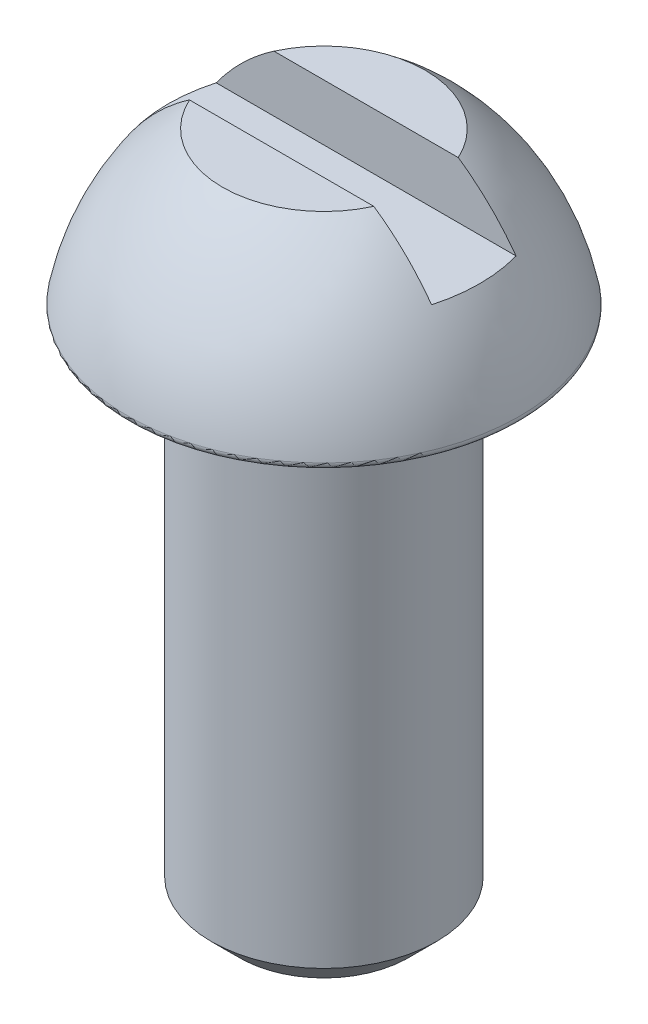
ISO-10303-21;
HEADER;
FILE_DESCRIPTION(('STEP AP214'),'2;1');
FILE_NAME('part.step','',(''),(''),'','','');
FILE_SCHEMA(('AUTOMOTIVE_DESIGN { 1 0 10303 214 1 1 1 1 }'));
ENDSEC;
DATA;
#1=APPLICATION_CONTEXT('core data for automotive mechanical design processes');
#2=APPLICATION_PROTOCOL_DEFINITION('international standard','automotive_design',2000,#1);
#3=PRODUCT_CONTEXT('',#1,'mechanical');
#4=PRODUCT('Part','Part','',(#3));
#5=PRODUCT_RELATED_PRODUCT_CATEGORY('part','',(#4));
#6=PRODUCT_DEFINITION_FORMATION('','',#4);
#7=PRODUCT_DEFINITION_CONTEXT('part definition',#1,'design');
#8=PRODUCT_DEFINITION('design','',#6,#7);
#9=PRODUCT_DEFINITION_SHAPE('','',#8);
#10=(LENGTH_UNIT() NAMED_UNIT(*) SI_UNIT(.MILLI.,.METRE.));
#11=(NAMED_UNIT(*) PLANE_ANGLE_UNIT() SI_UNIT($,.RADIAN.));
#12=(NAMED_UNIT(*) SI_UNIT($,.STERADIAN.) SOLID_ANGLE_UNIT());
#13=UNCERTAINTY_MEASURE_WITH_UNIT(LENGTH_MEASURE(1.E-05),#10,'distance_accuracy_value','');
#14=(GEOMETRIC_REPRESENTATION_CONTEXT(3) GLOBAL_UNCERTAINTY_ASSIGNED_CONTEXT((#13)) GLOBAL_UNIT_ASSIGNED_CONTEXT((#10,
#11,#12)) REPRESENTATION_CONTEXT('',''));
#15=CARTESIAN_POINT('',(0.,0.,0.));
#16=DIRECTION('',(0.,0.,1.));
#17=DIRECTION('',(1.,0.,0.));
#18=AXIS2_PLACEMENT_3D('',#15,#16,#17);
#19=CARTESIAN_POINT('',(0.,12.,0.));
#20=DIRECTION('',(0.,1.,0.));
#21=DIRECTION('',(0.,0.,1.));
#22=AXIS2_PLACEMENT_3D('',#19,#20,#21);
#23=PLANE('',#22);
#24=DIRECTION('',(-1.,0.,0.));
#25=VECTOR('',#24,1.);
#26=CARTESIAN_POINT('',(-4.,12.,-0.75));
#27=LINE('',#26,#25);
#28=CARTESIAN_POINT('',(1.63630681719536,12.,-0.75));
#29=VERTEX_POINT('',#28);
#30=CARTESIAN_POINT('',(-1.63630681719536,12.,-0.75));
#31=VERTEX_POINT('',#30);
#32=EDGE_CURVE('E83',#29,#31,#27,.T.);
#33=ORIENTED_EDGE('',*,*,#32,.F.);
#34=CARTESIAN_POINT('',(0.,12.,0.));
#35=DIRECTION('',(0.,-1.,0.));
#36=DIRECTION('',(0.,0.,-1.));
#37=AXIS2_PLACEMENT_3D('',#34,#35,#36);
#38=CIRCLE('',#37,1.8);
#39=EDGE_CURVE('E90',#31,#29,#38,.T.);
#40=ORIENTED_EDGE('',*,*,#39,.F.);
#41=EDGE_LOOP('',(#33,#40));
#42=FACE_BOUND('',#41,.T.);
#43=ADVANCED_FACE('F29',(#42),#23,.T.);
#44=CARTESIAN_POINT('',(1.5,0.,0.));
#45=DIRECTION('',(0.,-1.,0.));
#46=DIRECTION('',(0.,0.,-1.));
#47=AXIS2_PLACEMENT_3D('',#44,#45,#46);
#48=PLANE('',#47);
#49=CARTESIAN_POINT('',(0.,0.,0.));
#50=DIRECTION('',(0.,-1.,0.));
#51=DIRECTION('',(0.,0.,-1.));
#52=AXIS2_PLACEMENT_3D('',#49,#50,#51);
#53=CIRCLE('',#52,1.5);
#54=CARTESIAN_POINT('',(0.,0.,-1.5));
#55=VERTEX_POINT('',#54);
#56=EDGE_CURVE('E188',#55,#55,#53,.T.);
#57=ORIENTED_EDGE('',*,*,#56,.T.);
#58=EDGE_LOOP('',(#57));
#59=FACE_BOUND('',#58,.T.);
#60=ADVANCED_FACE('F31',(#59),#48,.T.);
#61=DIRECTION('',(1.,0.,0.));
#62=VECTOR('',#61,1.);
#63=CARTESIAN_POINT('',(-4.,12.,0.750000000000001));
#64=LINE('',#63,#62);
#65=CARTESIAN_POINT('',(-1.63630681719536,12.,0.75));
#66=VERTEX_POINT('',#65);
#67=CARTESIAN_POINT('',(1.63630681719536,12.,0.75));
#68=VERTEX_POINT('',#67);
#69=EDGE_CURVE('E74',#66,#68,#64,.T.);
#70=ORIENTED_EDGE('',*,*,#69,.F.);
#71=EDGE_CURVE('E82',#68,#66,#38,.T.);
#72=ORIENTED_EDGE('',*,*,#71,.F.);
#73=EDGE_LOOP('',(#70,#72));
#74=FACE_BOUND('',#73,.T.);
#75=ADVANCED_FACE('F81',(#74),#23,.T.);
#76=CARTESIAN_POINT('',(0.,8.48059216714296,0.));
#77=DIRECTION('',(0.,-1.,0.));
#78=DIRECTION('',(0.,0.,-1.));
#79=AXIS2_PLACEMENT_3D('',#76,#77,#78);
#80=DEGENERATE_TOROIDAL_SURFACE('',#79,0.840789371764535,4.4,.F.);
#81=CARTESIAN_POINT('',(0.,12.582956019202,-0.75));
#82=CARTESIAN_POINT('',(-0.0580403365894685,12.5829593395836,-0.75));
#83=CARTESIAN_POINT('',(-0.116075308294297,12.5803208986943,-0.75));
#84=CARTESIAN_POINT('',(-0.231703825295864,12.5700507903085,-0.75));
#85=CARTESIAN_POINT('',(-0.289297267283977,12.5624179882653,-0.75));
#86=CARTESIAN_POINT('',(-0.404014123859633,12.5427255625741,-0.75));
#87=CARTESIAN_POINT('',(-0.461133551541634,12.5306431851174,-0.75));
#88=CARTESIAN_POINT('',(-0.574433896996379,12.5026978582504,-0.75));
#89=CARTESIAN_POINT('',(-0.630614657949978,12.4868342837577,-0.75));
#90=CARTESIAN_POINT('',(-0.77891142804328,12.4402237853859,-0.75));
#91=CARTESIAN_POINT('',(-0.870124449278167,12.4065875640343,-0.75));
#92=CARTESIAN_POINT('',(-1.04941203337837,12.3317851463396,-0.75));
#93=CARTESIAN_POINT('',(-1.13748498224242,12.2906151424381,-0.75));
#94=CARTESIAN_POINT('',(-1.31016932028902,12.201612321418,-0.75));
#95=CARTESIAN_POINT('',(-1.39478152209074,12.1537810801817,-0.75));
#96=CARTESIAN_POINT('',(-1.56027313132481,12.0520265606294,-0.75));
#97=CARTESIAN_POINT('',(-1.64115103467018,11.9981008572434,-0.75));
#98=CARTESIAN_POINT('',(-1.88564150957767,11.8221326577803,-0.75));
#99=CARTESIAN_POINT('',(-2.04242778065091,11.6903970240503,-0.75));
#100=CARTESIAN_POINT('',(-2.33504416247434,11.4057334825201,-0.75));
#101=CARTESIAN_POINT('',(-2.47088393151782,11.252815403923,-0.75));
#102=CARTESIAN_POINT('',(-2.73808918793351,10.9044589140908,-0.75));
#103=CARTESIAN_POINT('',(-2.86566034324544,10.7060883737321,-0.75));
#104=CARTESIAN_POINT('',(-3.08659995570262,10.291014147451,-0.75));
#105=CARTESIAN_POINT('',(-3.17994398310539,10.0742975021984,-0.75));
#106=CARTESIAN_POINT('',(-3.3316107625363,9.62349946901331,-0.75));
#107=CARTESIAN_POINT('',(-3.38910285580516,9.38913797839262,-0.75));
#108=CARTESIAN_POINT('',(-3.46413669819829,8.91415386957744,-0.75));
#109=CARTESIAN_POINT('',(-3.48168471936045,8.6735322403552,-0.75));
#110=CARTESIAN_POINT('',(-3.47636375112643,8.19146531902089,-0.75));
#111=CARTESIAN_POINT('',(-3.45328200753749,7.95002233821973,-0.75));
#112=CARTESIAN_POINT('',(-3.36691092575206,7.47438871675542,-0.75));
#113=CARTESIAN_POINT('',(-3.30361384354493,7.24019948201081,-0.75));
#114=CARTESIAN_POINT('',(-3.13853461690549,6.78576838284434,-0.75));
#115=CARTESIAN_POINT('',(-3.03674780230034,6.56552821472765,-0.75));
#116=CARTESIAN_POINT('',(-2.79748898455758,6.14543434530356,-0.75));
#117=CARTESIAN_POINT('',(-2.66002925682844,5.94557366409833,-0.75));
#118=CARTESIAN_POINT('',(-2.35398331518638,5.57312683166752,-0.75));
#119=CARTESIAN_POINT('',(-2.18556432603752,5.40040298083114,-0.75));
#120=CARTESIAN_POINT('',(-1.82115425247853,5.08622151872325,-0.75));
#121=CARTESIAN_POINT('',(-1.62514447486366,4.94478527377352,-0.75));
#122=CARTESIAN_POINT('',(-1.34776674340392,4.78090232308241,-0.75));
#123=CARTESIAN_POINT('',(-1.27608666405692,4.74151787639481,-0.75));
#124=CARTESIAN_POINT('',(-1.13031662931064,4.66752384040662,-0.75));
#125=CARTESIAN_POINT('',(-1.05622777805294,4.63291210047051,-0.75));
#126=CARTESIAN_POINT('',(-0.905939057170742,4.56903639211666,-0.75));
#127=CARTESIAN_POINT('',(-0.829743756807608,4.53976175661365,-0.75));
#128=CARTESIAN_POINT('',(-0.675322796693612,4.487276486063,-0.75));
#129=CARTESIAN_POINT('',(-0.59709754652317,4.46406463803318,-0.75));
#130=CARTESIAN_POINT('',(-0.40045511557039,4.41559239049113,-0.75));
#131=CARTESIAN_POINT('',(-0.280835490872069,4.39473521709551,-0.75));
#132=CARTESIAN_POINT('',(-0.100258332846961,4.37990687047812,-0.75));
#133=CARTESIAN_POINT('',(-0.0399425862774646,4.37770031288144,-0.75));
#134=CARTESIAN_POINT('',(0.0806433007261479,4.37897042047402,-0.75));
#135=CARTESIAN_POINT('',(0.140913432784944,4.38244795397452,-0.75));
#136=CARTESIAN_POINT('',(0.274323575007443,4.39608509237298,-0.75));
#137=CARTESIAN_POINT('',(0.347326105712831,4.40756561932451,-0.75));
#138=CARTESIAN_POINT('',(0.491980419278099,4.43714756303982,-0.75));
#139=CARTESIAN_POINT('',(0.563631290291077,4.45525329231733,-0.75));
#140=CARTESIAN_POINT('',(0.705783095763593,4.49705377559488,-0.75));
#141=CARTESIAN_POINT('',(0.776273170604393,4.52078500764333,-0.75));
#142=CARTESIAN_POINT('',(0.915452045583009,4.5729729004493,-0.75));
#143=CARTESIAN_POINT('',(0.984141068458322,4.60142897365993,-0.75));
#144=CARTESIAN_POINT('',(1.15197683814272,4.67715387648495,-0.75));
#145=CARTESIAN_POINT('',(1.25000641419588,4.7269178233559,-0.75));
#146=CARTESIAN_POINT('',(1.44148266277653,4.83457435685832,-0.75));
#147=CARTESIAN_POINT('',(1.5349275378867,4.89247009771191,-0.75));
#148=CARTESIAN_POINT('',(1.80720894369679,5.0769572681703,-0.75));
#149=CARTESIAN_POINT('',(1.97867428024067,5.21466444536891,-0.75));
#150=CARTESIAN_POINT('',(2.30057882359354,5.51755979602639,-0.75));
#151=CARTESIAN_POINT('',(2.45061872617133,5.68316879447206,-0.75));
#152=CARTESIAN_POINT('',(2.72303347864184,6.03594995610866,-0.75));
#153=CARTESIAN_POINT('',(2.84538854797858,6.22313739365556,-0.75));
#154=CARTESIAN_POINT('',(3.0669452537441,6.62796552242616,-0.75));
#155=CARTESIAN_POINT('',(3.16393546860489,6.84681977932326,-0.75));
#156=CARTESIAN_POINT('',(3.3202537241883,7.297569556064,-0.75));
#157=CARTESIAN_POINT('',(3.37958124435236,7.52946525611298,-0.75));
#158=CARTESIAN_POINT('',(3.45944916658007,8.00256011423152,-0.75));
#159=CARTESIAN_POINT('',(3.47954221342216,8.24383494065859,-0.75));
#160=CARTESIAN_POINT('',(3.47903920633119,8.72636954686723,-0.75));
#161=CARTESIAN_POINT('',(3.45843779474091,8.96762932048506,-0.75));
#162=CARTESIAN_POINT('',(3.37700227586657,9.44385807108613,-0.75));
#163=CARTESIAN_POINT('',(3.31607248015514,9.6788106998712,-0.75));
#164=CARTESIAN_POINT('',(3.15558147504914,10.1350583184714,-0.75));
#165=CARTESIAN_POINT('',(3.05603087364097,10.35635703928,-0.75));
#166=CARTESIAN_POINT('',(2.82125315986839,10.7785534755014,-0.75));
#167=CARTESIAN_POINT('',(2.68610201750677,10.9794933862572,-0.75));
#168=CARTESIAN_POINT('',(2.38359677259807,11.3556652638098,-0.75));
#169=CARTESIAN_POINT('',(2.21622040763452,11.5308793098386,-0.75));
#170=CARTESIAN_POINT('',(1.85550522686063,11.8482347710406,-0.75));
#171=CARTESIAN_POINT('',(1.66246393917611,11.9907105657179,-0.75));
#172=CARTESIAN_POINT('',(1.35618615550022,12.1766401580921,-0.75));
#173=CARTESIAN_POINT('',(1.25120826348287,12.2340240670664,-0.75));
#174=CARTESIAN_POINT('',(1.03617692562933,12.3383858147761,-0.75));
#175=CARTESIAN_POINT('',(0.926126764483634,12.3853702766773,-0.75));
#176=CARTESIAN_POINT('',(0.748333059865971,12.4498941980304,-0.75));
#177=CARTESIAN_POINT('',(0.682067044638179,12.4715455106505,-0.75));
#178=CARTESIAN_POINT('',(0.548103407540832,12.5099063592771,-0.75));
#179=CARTESIAN_POINT('',(0.48040599481353,12.5266166119508,-0.75));
#180=CARTESIAN_POINT('',(0.344277910119605,12.5540067439061,-0.75));
#181=CARTESIAN_POINT('',(0.275855934050042,12.5647288596414,-0.75));
#182=CARTESIAN_POINT('',(0.138286451791919,12.5791993697233,-0.75));
#183=CARTESIAN_POINT('',(0.0691394194295269,12.5829520638622,-0.75));
#184=CARTESIAN_POINT('',(0.,12.582956019202,-0.75));
#185=B_SPLINE_CURVE_WITH_KNOTS('',3,(#81,#82,#83,#84,#85,#86,#87,#88,#89,#90,#91,#92,#93,#94,
#95,#96,#97,#98,#99,#100,#101,#102,#103,#104,#105,#106,#107,#108,#109,#110,#111,#112,#113,#114,
#115,#116,#117,#118,#119,#120,#121,#122,#123,#124,#125,#126,#127,#128,#129,#130,#131,#132,#133,
#134,#135,#136,#137,#138,#139,#140,#141,#142,#143,#144,#145,#146,#147,#148,#149,#150,#151,#152,
#153,#154,#155,#156,#157,#158,#159,#160,#161,#162,#163,#164,#165,#166,#167,#168,#169,#170,#171,
#172,#173,#174,#175,#176,#177,#178,#179,#180,#181,#182,#183,#184),.UNSPECIFIED.,.T.,.F.,(4,2,2,
2,2,2,2,2,2,2,2,2,2,2,2,2,2,2,2,2,2,2,2,2,2,2,2,2,2,2,2,2,2,2,2,2,2,2,2,2,2,2,2,2,2,2,2,2,2,2,2,
4),(0.,0.174056495817505,0.348152545006498,0.523151520093731,0.698179444943365,
0.989399293553119,1.2807667326379,1.57206535819539,1.86348030631321,2.47536649095358,
3.0869696897974,3.79121267902729,4.49595735040306,5.21647654319957,5.93688259191074,
6.66107221349852,7.38540132993541,8.10981836145929,8.83398644356733,9.55435215458275,
10.2752082953845,10.5204514160815,10.7655836637898,11.0102204705775,11.2548082953121,
11.6172628854862,11.7980871690973,11.9789390783095,12.200253357451,12.4217119527328,
12.6446478738707,12.8675560930527,13.1968979589879,13.5263679271676,14.1830800928447,
14.8507678908608,15.5189312496778,16.2337190110351,16.9485166516853,17.6714179610551,
18.3944144508429,19.1191325965221,19.8436518244594,20.5666373119416,21.2901240693477,
22.0058556355985,22.364350143391,22.7226156731836,22.9316085776758,23.1405711542779,
23.3480406026555,23.5553820099578),.UNSPECIFIED.);
#186=CARTESIAN_POINT('',(-2.66290418993355,11.,-0.75));
#187=VERTEX_POINT('',#186);
#188=EDGE_CURVE('E11',#31,#187,#185,.T.);
#189=ORIENTED_EDGE('',*,*,#188,.F.);
#190=ORIENTED_EDGE('',*,*,#39,.T.);
#191=CARTESIAN_POINT('',(2.66290418993355,11.,-0.75));
#192=VERTEX_POINT('',#191);
#193=EDGE_CURVE('E33',#192,#29,#185,.T.);
#194=ORIENTED_EDGE('',*,*,#193,.F.);
#195=CARTESIAN_POINT('',(0.,11.,0.));
#196=DIRECTION('',(0.,1.,0.));
#197=DIRECTION('',(0.,0.,1.));
#198=AXIS2_PLACEMENT_3D('',#195,#196,#197);
#199=CIRCLE('',#198,2.76650659221439);
#200=CARTESIAN_POINT('',(2.66290418993355,11.,0.75));
#201=VERTEX_POINT('',#200);
#202=EDGE_CURVE('E102',#192,#201,#199,.F.);
#203=ORIENTED_EDGE('',*,*,#202,.T.);
#204=CARTESIAN_POINT('',(0.,12.582956019202,0.75));
#205=CARTESIAN_POINT('',(0.0580403365894684,12.5829593395836,0.75));
#206=CARTESIAN_POINT('',(0.116075308294297,12.5803208986943,0.75));
#207=CARTESIAN_POINT('',(0.231703825295864,12.5700507903085,0.75));
#208=CARTESIAN_POINT('',(0.289297267283977,12.5624179882653,0.75));
#209=CARTESIAN_POINT('',(0.404014123859633,12.5427255625741,0.75));
#210=CARTESIAN_POINT('',(0.461133551541634,12.5306431851174,0.75));
#211=CARTESIAN_POINT('',(0.574433896996379,12.5026978582504,0.75));
#212=CARTESIAN_POINT('',(0.630614657949978,12.4868342837577,0.75));
#213=CARTESIAN_POINT('',(0.778911428043281,12.4402237853859,0.75));
#214=CARTESIAN_POINT('',(0.870124449278168,12.4065875640343,0.75));
#215=CARTESIAN_POINT('',(1.04941203337837,12.3317851463396,0.75));
#216=CARTESIAN_POINT('',(1.13748498224243,12.2906151424381,0.75));
#217=CARTESIAN_POINT('',(1.31016932028902,12.201612321418,0.75));
#218=CARTESIAN_POINT('',(1.39478152209074,12.1537810801817,0.75));
#219=CARTESIAN_POINT('',(1.56027313132481,12.0520265606294,0.75));
#220=CARTESIAN_POINT('',(1.64115103467018,11.9981008572434,0.75));
#221=CARTESIAN_POINT('',(1.88564150957767,11.8221326577803,0.75));
#222=CARTESIAN_POINT('',(2.04242778065091,11.6903970240503,0.75));
#223=CARTESIAN_POINT('',(2.33504416247435,11.4057334825201,0.75));
#224=CARTESIAN_POINT('',(2.47088393151782,11.252815403923,0.75));
#225=CARTESIAN_POINT('',(2.73808918793351,10.9044589140908,0.75));
#226=CARTESIAN_POINT('',(2.86566034324544,10.7060883737321,0.75));
#227=CARTESIAN_POINT('',(3.08659995570262,10.291014147451,0.75));
#228=CARTESIAN_POINT('',(3.17994398310539,10.0742975021984,0.75));
#229=CARTESIAN_POINT('',(3.3316107625363,9.62349946901331,0.75));
#230=CARTESIAN_POINT('',(3.38910285580516,9.38913797839262,0.75));
#231=CARTESIAN_POINT('',(3.46413669819829,8.91415386957744,0.75));
#232=CARTESIAN_POINT('',(3.48168471936045,8.6735322403552,0.75));
#233=CARTESIAN_POINT('',(3.47636375112643,8.19146531902089,0.75));
#234=CARTESIAN_POINT('',(3.45328200753749,7.95002233821973,0.75));
#235=CARTESIAN_POINT('',(3.36691092575206,7.47438871675542,0.75));
#236=CARTESIAN_POINT('',(3.30361384354493,7.24019948201081,0.75));
#237=CARTESIAN_POINT('',(3.13853461690549,6.78576838284434,0.75));
#238=CARTESIAN_POINT('',(3.03674780230034,6.56552821472765,0.75));
#239=CARTESIAN_POINT('',(2.79748898455758,6.14543434530356,0.75));
#240=CARTESIAN_POINT('',(2.66002925682844,5.94557366409833,0.75));
#241=CARTESIAN_POINT('',(2.35398331518638,5.57312683166752,0.75));
#242=CARTESIAN_POINT('',(2.18556432603752,5.40040298083114,0.75));
#243=CARTESIAN_POINT('',(1.82115425247853,5.08622151872324,0.75));
#244=CARTESIAN_POINT('',(1.62514447486365,4.94478527377352,0.75));
#245=CARTESIAN_POINT('',(1.34776674340392,4.78090232308241,0.75));
#246=CARTESIAN_POINT('',(1.27608666405692,4.74151787639481,0.75));
#247=CARTESIAN_POINT('',(1.13031662931064,4.66752384040662,0.75));
#248=CARTESIAN_POINT('',(1.05622777805294,4.63291210047051,0.75));
#249=CARTESIAN_POINT('',(0.905939057170741,4.56903639211665,0.75));
#250=CARTESIAN_POINT('',(0.829743756807607,4.53976175661365,0.75));
#251=CARTESIAN_POINT('',(0.675322796693611,4.487276486063,0.75));
#252=CARTESIAN_POINT('',(0.597097546523169,4.46406463803318,0.75));
#253=CARTESIAN_POINT('',(0.40045511557039,4.41559239049113,0.75));
#254=CARTESIAN_POINT('',(0.280835490872069,4.39473521709551,0.75));
#255=CARTESIAN_POINT('',(0.100258332846961,4.37990687047812,0.75));
#256=CARTESIAN_POINT('',(0.0399425862774646,4.37770031288144,0.75));
#257=CARTESIAN_POINT('',(-0.080643300726148,4.37897042047402,0.75));
#258=CARTESIAN_POINT('',(-0.140913432784944,4.38244795397452,0.75));
#259=CARTESIAN_POINT('',(-0.274323575007443,4.39608509237298,0.75));
#260=CARTESIAN_POINT('',(-0.347326105712831,4.40756561932451,0.75));
#261=CARTESIAN_POINT('',(-0.4919804192781,4.43714756303982,0.75));
#262=CARTESIAN_POINT('',(-0.563631290291077,4.45525329231733,0.75));
#263=CARTESIAN_POINT('',(-0.705783095763592,4.49705377559488,0.75));
#264=CARTESIAN_POINT('',(-0.776273170604392,4.52078500764333,0.75));
#265=CARTESIAN_POINT('',(-0.915452045583009,4.5729729004493,0.75));
#266=CARTESIAN_POINT('',(-0.984141068458322,4.60142897365993,0.75));
#267=CARTESIAN_POINT('',(-1.15197683814272,4.67715387648495,0.75));
#268=CARTESIAN_POINT('',(-1.25000641419588,4.7269178233559,0.75));
#269=CARTESIAN_POINT('',(-1.44148266277652,4.83457435685832,0.75));
#270=CARTESIAN_POINT('',(-1.5349275378867,4.89247009771191,0.75));
#271=CARTESIAN_POINT('',(-1.80720894369678,5.0769572681703,0.75));
#272=CARTESIAN_POINT('',(-1.97867428024067,5.21466444536891,0.75));
#273=CARTESIAN_POINT('',(-2.30057882359354,5.51755979602639,0.75));
#274=CARTESIAN_POINT('',(-2.45061872617133,5.68316879447205,0.75));
#275=CARTESIAN_POINT('',(-2.72303347864184,6.03594995610866,0.75));
#276=CARTESIAN_POINT('',(-2.84538854797858,6.22313739365556,0.75));
#277=CARTESIAN_POINT('',(-3.06694525374409,6.62796552242616,0.75));
#278=CARTESIAN_POINT('',(-3.16393546860489,6.84681977932326,0.75));
#279=CARTESIAN_POINT('',(-3.3202537241883,7.297569556064,0.75));
#280=CARTESIAN_POINT('',(-3.37958124435236,7.52946525611298,0.75));
#281=CARTESIAN_POINT('',(-3.45944916658007,8.00256011423152,0.75));
#282=CARTESIAN_POINT('',(-3.47954221342216,8.24383494065859,0.75));
#283=CARTESIAN_POINT('',(-3.47903920633119,8.72636954686723,0.75));
#284=CARTESIAN_POINT('',(-3.45843779474091,8.96762932048506,0.75));
#285=CARTESIAN_POINT('',(-3.37700227586657,9.44385807108613,0.75));
#286=CARTESIAN_POINT('',(-3.31607248015514,9.6788106998712,0.75));
#287=CARTESIAN_POINT('',(-3.15558147504914,10.1350583184714,0.75));
#288=CARTESIAN_POINT('',(-3.05603087364097,10.35635703928,0.75));
#289=CARTESIAN_POINT('',(-2.82125315986839,10.7785534755014,0.75));
#290=CARTESIAN_POINT('',(-2.68610201750678,10.9794933862572,0.75));
#291=CARTESIAN_POINT('',(-2.38359677259807,11.3556652638098,0.75));
#292=CARTESIAN_POINT('',(-2.21622040763453,11.5308793098386,0.75));
#293=CARTESIAN_POINT('',(-1.85550522686063,11.8482347710406,0.75));
#294=CARTESIAN_POINT('',(-1.6624639391761,11.9907105657179,0.75));
#295=CARTESIAN_POINT('',(-1.35618615550022,12.1766401580921,0.75));
#296=CARTESIAN_POINT('',(-1.25120826348287,12.2340240670664,0.75));
#297=CARTESIAN_POINT('',(-1.03617692562933,12.3383858147761,0.75));
#298=CARTESIAN_POINT('',(-0.926126764483634,12.3853702766773,0.75));
#299=CARTESIAN_POINT('',(-0.748333059865971,12.4498941980304,0.75));
#300=CARTESIAN_POINT('',(-0.682067044638179,12.4715455106505,0.75));
#301=CARTESIAN_POINT('',(-0.548103407540832,12.5099063592771,0.75));
#302=CARTESIAN_POINT('',(-0.480405994813529,12.5266166119508,0.75));
#303=CARTESIAN_POINT('',(-0.344277910119603,12.5540067439061,0.75));
#304=CARTESIAN_POINT('',(-0.27585593405004,12.5647288596414,0.75));
#305=CARTESIAN_POINT('',(-0.138286451791917,12.5791993697233,0.75));
#306=CARTESIAN_POINT('',(-0.069139419429526,12.5829520638622,0.75));
#307=CARTESIAN_POINT('',(0.,12.582956019202,0.75));
#308=B_SPLINE_CURVE_WITH_KNOTS('',3,(#204,#205,#206,#207,#208,#209,#210,#211,#212,#213,#214,
#215,#216,#217,#218,#219,#220,#221,#222,#223,#224,#225,#226,#227,#228,#229,#230,#231,#232,#233,
#234,#235,#236,#237,#238,#239,#240,#241,#242,#243,#244,#245,#246,#247,#248,#249,#250,#251,#252,
#253,#254,#255,#256,#257,#258,#259,#260,#261,#262,#263,#264,#265,#266,#267,#268,#269,#270,#271,
#272,#273,#274,#275,#276,#277,#278,#279,#280,#281,#282,#283,#284,#285,#286,#287,#288,#289,#290,
#291,#292,#293,#294,#295,#296,#297,#298,#299,#300,#301,#302,#303,#304,#305,#306,#307),
.UNSPECIFIED.,.T.,.F.,(4,2,2,2,2,2,2,2,2,2,2,2,2,2,2,2,2,2,2,2,2,2,2,2,2,2,2,2,2,2,2,2,2,2,2,2,
2,2,2,2,2,2,2,2,2,2,2,2,2,2,2,4),(0.,0.174056495817505,0.348152545006498,0.523151520093731,
0.698179444943365,0.989399293553119,1.2807667326379,1.5720653581954,1.86348030631321,
2.47536649095358,3.0869696897974,3.79121267902729,4.49595735040306,5.21647654319957,
5.93688259191074,6.66107221349852,7.38540132993541,8.10981836145929,8.83398644356733,
9.55435215458275,10.2752082953845,10.5204514160815,10.7655836637898,11.0102204705775,
11.2548082953121,11.6172628854862,11.7980871690973,11.9789390783095,12.200253357451,
12.4217119527328,12.6446478738707,12.8675560930527,13.1968979589879,13.5263679271676,
14.1830800928446,14.8507678908608,15.5189312496778,16.2337190110351,16.9485166516853,
17.6714179610551,18.3944144508429,19.1191325965221,19.8436518244594,20.5666373119416,
21.2901240693477,22.0058556355985,22.364350143391,22.7226156731836,22.9316085776758,
23.1405711542779,23.3480406026555,23.5553820099578),.UNSPECIFIED.);
#309=EDGE_CURVE('E78',#68,#201,#308,.T.);
#310=ORIENTED_EDGE('',*,*,#309,.F.);
#311=ORIENTED_EDGE('',*,*,#71,.T.);
#312=CARTESIAN_POINT('',(-2.66290418993355,11.,0.75));
#313=VERTEX_POINT('',#312);
#314=EDGE_CURVE('E42',#313,#66,#308,.T.);
#315=ORIENTED_EDGE('',*,*,#314,.F.);
#316=EDGE_CURVE('E54',#313,#187,#199,.F.);
#317=ORIENTED_EDGE('',*,*,#316,.T.);
#318=EDGE_LOOP('',(#189,#190,#194,#203,#310,#311,#315,#317));
#319=FACE_BOUND('',#318,.T.);
#320=CARTESIAN_POINT('',(0.,9.31905599611295,0.));
#321=DIRECTION('',(0.,-1.,0.));
#322=DIRECTION('',(0.,0.,-1.));
#323=AXIS2_PLACEMENT_3D('',#320,#321,#322);
#324=CIRCLE('',#323,3.47858308352443);
#325=CARTESIAN_POINT('',(0.,9.31905599611295,-3.47858308352443));
#326=VERTEX_POINT('',#325);
#327=EDGE_CURVE('E93',#326,#326,#324,.F.);
#328=ORIENTED_EDGE('',*,*,#327,.T.);
#329=EDGE_LOOP('',(#328));
#330=FACE_BOUND('',#329,.T.);
#331=ADVANCED_FACE('F86',(#319,#330),#80,.F.);
#332=CARTESIAN_POINT('',(3.5,9.2,0.));
#333=DIRECTION('',(0.,-1.,0.));
#334=DIRECTION('',(0.,0.,-1.));
#335=AXIS2_PLACEMENT_3D('',#332,#333,#334);
#336=PLANE('',#335);
#337=CARTESIAN_POINT('',(0.,9.2,0.));
#338=DIRECTION('',(0.,-1.,0.));
#339=DIRECTION('',(0.,0.,-1.));
#340=AXIS2_PLACEMENT_3D('',#337,#338,#339);
#341=CIRCLE('',#340,3.3804155277224);
#342=CARTESIAN_POINT('',(0.,9.2,-3.3804155277224));
#343=VERTEX_POINT('',#342);
#344=EDGE_CURVE('E89',#343,#343,#341,.T.);
#345=ORIENTED_EDGE('',*,*,#344,.T.);
#346=EDGE_LOOP('',(#345));
#347=FACE_BOUND('',#346,.T.);
#348=CARTESIAN_POINT('',(0.,9.2,0.));
#349=DIRECTION('',(0.,-1.,0.));
#350=DIRECTION('',(0.,0.,-1.));
#351=AXIS2_PLACEMENT_3D('',#348,#349,#350);
#352=CIRCLE('',#351,2.);
#353=CARTESIAN_POINT('',(0.,9.2,-2.));
#354=VERTEX_POINT('',#353);
#355=EDGE_CURVE('E96',#354,#354,#352,.T.);
#356=ORIENTED_EDGE('',*,*,#355,.F.);
#357=EDGE_LOOP('',(#356));
#358=FACE_BOUND('',#357,.T.);
#359=ADVANCED_FACE('F125',(#347,#358),#336,.T.);
#360=CARTESIAN_POINT('',(0.,0.,0.));
#361=DIRECTION('',(0.,-1.,0.));
#362=DIRECTION('',(0.,0.,-1.));
#363=AXIS2_PLACEMENT_3D('',#360,#361,#362);
#364=CYLINDRICAL_SURFACE('',#363,2.);
#365=ORIENTED_EDGE('',*,*,#355,.T.);
#366=EDGE_LOOP('',(#365));
#367=FACE_BOUND('',#366,.T.);
#368=CARTESIAN_POINT('',(0.,0.500000000000003,0.));
#369=DIRECTION('',(0.,-1.,0.));
#370=DIRECTION('',(0.,0.,-1.));
#371=AXIS2_PLACEMENT_3D('',#368,#369,#370);
#372=CIRCLE('',#371,2.);
#373=CARTESIAN_POINT('',(0.,0.500000000000003,-2.));
#374=VERTEX_POINT('',#373);
#375=EDGE_CURVE('E194',#374,#374,#372,.T.);
#376=ORIENTED_EDGE('',*,*,#375,.F.);
#377=EDGE_LOOP('',(#376));
#378=FACE_BOUND('',#377,.T.);
#379=ADVANCED_FACE('F122',(#367,#378),#364,.T.);
#380=CARTESIAN_POINT('',(0.,0.,0.));
#381=DIRECTION('',(0.,1.,0.));
#382=DIRECTION('',(0.,0.,1.));
#383=AXIS2_PLACEMENT_3D('',#380,#381,#382);
#384=CONICAL_SURFACE('',#383,1.5,0.785398163397445);
#385=ORIENTED_EDGE('',*,*,#375,.T.);
#386=EDGE_LOOP('',(#385));
#387=FACE_BOUND('',#386,.T.);
#388=ORIENTED_EDGE('',*,*,#56,.F.);
#389=EDGE_LOOP('',(#388));
#390=FACE_BOUND('',#389,.T.);
#391=ADVANCED_FACE('F118',(#387,#390),#384,.T.);
#392=CARTESIAN_POINT('',(0.,9.3,0.));
#393=DIRECTION('',(0.,-1.,0.));
#394=DIRECTION('',(0.,0.,-1.));
#395=AXIS2_PLACEMENT_3D('',#392,#393,#394);
#396=TOROIDAL_SURFACE('',#395,3.3804155277224,0.1);
#397=ORIENTED_EDGE('',*,*,#327,.F.);
#398=EDGE_LOOP('',(#397));
#399=FACE_BOUND('',#398,.T.);
#400=ORIENTED_EDGE('',*,*,#344,.F.);
#401=EDGE_LOOP('',(#400));
#402=FACE_BOUND('',#401,.T.);
#403=ADVANCED_FACE('F115',(#399,#402),#396,.T.);
#404=CARTESIAN_POINT('',(-4.,11.,-0.75));
#405=DIRECTION('',(0.,0.,-1.));
#406=DIRECTION('',(-1.,0.,0.));
#407=AXIS2_PLACEMENT_3D('',#404,#405,#406);
#408=PLANE('',#407);
#409=ORIENTED_EDGE('',*,*,#188,.T.);
#410=DIRECTION('',(-1.,0.,0.));
#411=VECTOR('',#410,1.);
#412=CARTESIAN_POINT('',(-4.,11.,-0.75));
#413=LINE('',#412,#411);
#414=EDGE_CURVE('E185',#192,#187,#413,.T.);
#415=ORIENTED_EDGE('',*,*,#414,.F.);
#416=ORIENTED_EDGE('',*,*,#193,.T.);
#417=ORIENTED_EDGE('',*,*,#32,.T.);
#418=EDGE_LOOP('',(#409,#415,#416,#417));
#419=FACE_BOUND('',#418,.T.);
#420=ADVANCED_FACE('F112',(#419),#408,.F.);
#421=CARTESIAN_POINT('',(-4.,11.,0.750000000000001));
#422=DIRECTION('',(0.,0.,1.));
#423=DIRECTION('',(1.,0.,0.));
#424=AXIS2_PLACEMENT_3D('',#421,#422,#423);
#425=PLANE('',#424);
#426=ORIENTED_EDGE('',*,*,#309,.T.);
#427=DIRECTION('',(1.,0.,0.));
#428=VECTOR('',#427,1.);
#429=CARTESIAN_POINT('',(-4.,11.,0.750000000000001));
#430=LINE('',#429,#428);
#431=EDGE_CURVE('E49',#313,#201,#430,.T.);
#432=ORIENTED_EDGE('',*,*,#431,.F.);
#433=ORIENTED_EDGE('',*,*,#314,.T.);
#434=ORIENTED_EDGE('',*,*,#69,.T.);
#435=EDGE_LOOP('',(#426,#432,#433,#434));
#436=FACE_BOUND('',#435,.T.);
#437=ADVANCED_FACE('F73',(#436),#425,.F.);
#438=CARTESIAN_POINT('',(-4.,11.,-0.75));
#439=DIRECTION('',(0.,1.,0.));
#440=DIRECTION('',(0.,0.,1.));
#441=AXIS2_PLACEMENT_3D('',#438,#439,#440);
#442=PLANE('',#441);
#443=ORIENTED_EDGE('',*,*,#431,.T.);
#444=ORIENTED_EDGE('',*,*,#202,.F.);
#445=ORIENTED_EDGE('',*,*,#414,.T.);
#446=ORIENTED_EDGE('',*,*,#316,.F.);
#447=EDGE_LOOP('',(#443,#444,#445,#446));
#448=FACE_BOUND('',#447,.T.);
#449=ADVANCED_FACE('F111',(#448),#442,.T.);
#450=CLOSED_SHELL('',(#43,#60,#75,#331,#359,#379,#391,#403,#420,#437,#449));
#451=MANIFOLD_SOLID_BREP('B2',#450);
#452=ADVANCED_BREP_SHAPE_REPRESENTATION('',(#18,#451),#14);
#453=SHAPE_DEFINITION_REPRESENTATION(#9,#452);
ENDSEC;
END-ISO-10303-21;
